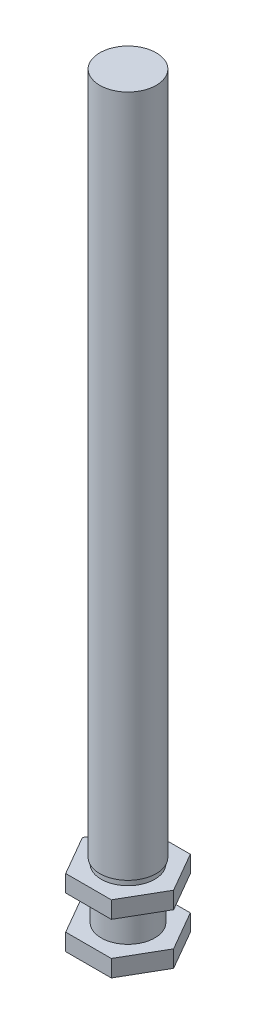
ISO-10303-21;
HEADER;
FILE_DESCRIPTION(('STEP AP214'),'2;1');
FILE_NAME('part.step','',(''),(''),'','','');
FILE_SCHEMA(('AUTOMOTIVE_DESIGN { 1 0 10303 214 1 1 1 1 }'));
ENDSEC;
DATA;
#1=APPLICATION_CONTEXT('core data for automotive mechanical design processes');
#2=APPLICATION_PROTOCOL_DEFINITION('international standard','automotive_design',2000,#1);
#3=PRODUCT_CONTEXT('',#1,'mechanical');
#4=PRODUCT('Part','Part','',(#3));
#5=PRODUCT_RELATED_PRODUCT_CATEGORY('part','',(#4));
#6=PRODUCT_DEFINITION_FORMATION('','',#4);
#7=PRODUCT_DEFINITION_CONTEXT('part definition',#1,'design');
#8=PRODUCT_DEFINITION('design','',#6,#7);
#9=PRODUCT_DEFINITION_SHAPE('','',#8);
#10=(LENGTH_UNIT() NAMED_UNIT(*) SI_UNIT(.MILLI.,.METRE.));
#11=(NAMED_UNIT(*) PLANE_ANGLE_UNIT() SI_UNIT($,.RADIAN.));
#12=(NAMED_UNIT(*) SI_UNIT($,.STERADIAN.) SOLID_ANGLE_UNIT());
#13=UNCERTAINTY_MEASURE_WITH_UNIT(LENGTH_MEASURE(1.E-05),#10,'distance_accuracy_value','');
#14=(GEOMETRIC_REPRESENTATION_CONTEXT(3) GLOBAL_UNCERTAINTY_ASSIGNED_CONTEXT((#13)) GLOBAL_UNIT_ASSIGNED_CONTEXT((#10,
#11,#12)) REPRESENTATION_CONTEXT('',''));
#15=CARTESIAN_POINT('',(0.,0.,0.));
#16=DIRECTION('',(0.,0.,1.));
#17=DIRECTION('',(1.,0.,0.));
#18=AXIS2_PLACEMENT_3D('',#15,#16,#17);
#19=CARTESIAN_POINT('',(0.,86.5,26.));
#20=DIRECTION('',(0.,-1.,0.));
#21=DIRECTION('',(0.,0.,-1.));
#22=AXIS2_PLACEMENT_3D('',#19,#20,#21);
#23=CYLINDRICAL_SURFACE('',#22,4.75);
#24=CARTESIAN_POINT('',(0.,76.5,26.));
#25=DIRECTION('',(0.,1.,0.));
#26=DIRECTION('',(0.,0.,1.));
#27=AXIS2_PLACEMENT_3D('',#24,#25,#26);
#28=CIRCLE('',#27,4.75);
#29=CARTESIAN_POINT('',(0.,76.5,30.75));
#30=VERTEX_POINT('',#29);
#31=EDGE_CURVE('E149',#30,#30,#28,.T.);
#32=ORIENTED_EDGE('',*,*,#31,.T.);
#33=EDGE_LOOP('',(#32));
#34=FACE_BOUND('',#33,.T.);
#35=CARTESIAN_POINT('',(0.,82.5,26.));
#36=DIRECTION('',(0.,1.,0.));
#37=DIRECTION('',(0.,0.,1.));
#38=AXIS2_PLACEMENT_3D('',#35,#36,#37);
#39=CIRCLE('',#38,4.75);
#40=CARTESIAN_POINT('',(0.,82.5,30.75));
#41=VERTEX_POINT('',#40);
#42=EDGE_CURVE('E11',#41,#41,#39,.T.);
#43=ORIENTED_EDGE('',*,*,#42,.F.);
#44=EDGE_LOOP('',(#43));
#45=FACE_BOUND('',#44,.T.);
#46=ADVANCED_FACE('F39',(#34,#45),#23,.T.);
#47=CARTESIAN_POINT('',(4.04145188432746,76.5,33.));
#48=DIRECTION('',(-0.866025403784441,0.,-0.499999999999995));
#49=DIRECTION('',(-0.499999999999995,0.,0.866025403784442));
#50=AXIS2_PLACEMENT_3D('',#47,#48,#49);
#51=PLANE('',#50);
#52=DIRECTION('',(0.499999999999995,0.,-0.866025403784441));
#53=VECTOR('',#52,1.);
#54=CARTESIAN_POINT('',(4.04145188432746,73.5,33.));
#55=LINE('',#54,#53);
#56=CARTESIAN_POINT('',(4.04145188432746,73.5,33.));
#57=VERTEX_POINT('',#56);
#58=CARTESIAN_POINT('',(8.08290376865476,73.5,26.));
#59=VERTEX_POINT('',#58);
#60=EDGE_CURVE('E130',#57,#59,#55,.T.);
#61=ORIENTED_EDGE('',*,*,#60,.T.);
#62=DIRECTION('',(0.,-1.,0.));
#63=VECTOR('',#62,1.);
#64=CARTESIAN_POINT('',(8.08290376865476,76.5,26.));
#65=LINE('',#64,#63);
#66=CARTESIAN_POINT('',(8.08290376865476,76.5,26.));
#67=VERTEX_POINT('',#66);
#68=EDGE_CURVE('E147',#67,#59,#65,.T.);
#69=ORIENTED_EDGE('',*,*,#68,.F.);
#70=DIRECTION('',(0.499999999999995,0.,-0.866025403784441));
#71=VECTOR('',#70,1.);
#72=CARTESIAN_POINT('',(4.04145188432746,76.5,33.));
#73=LINE('',#72,#71);
#74=CARTESIAN_POINT('',(4.04145188432746,76.5,33.));
#75=VERTEX_POINT('',#74);
#76=EDGE_CURVE('E140',#75,#67,#73,.T.);
#77=ORIENTED_EDGE('',*,*,#76,.F.);
#78=DIRECTION('',(0.,-1.,0.));
#79=VECTOR('',#78,1.);
#80=CARTESIAN_POINT('',(4.04145188432746,76.5,33.));
#81=LINE('',#80,#79);
#82=EDGE_CURVE('E126',#75,#57,#81,.T.);
#83=ORIENTED_EDGE('',*,*,#82,.T.);
#84=EDGE_LOOP('',(#61,#69,#77,#83));
#85=FACE_BOUND('',#84,.T.);
#86=ADVANCED_FACE('F177',(#85),#51,.F.);
#87=CARTESIAN_POINT('',(8.08290376865476,76.5,26.));
#88=DIRECTION('',(-0.866025403784438,0.,0.500000000000001));
#89=DIRECTION('',(0.500000000000001,0.,0.866025403784438));
#90=AXIS2_PLACEMENT_3D('',#87,#88,#89);
#91=PLANE('',#90);
#92=DIRECTION('',(-0.500000000000001,0.,-0.866025403784438));
#93=VECTOR('',#92,1.);
#94=CARTESIAN_POINT('',(8.08290376865476,73.5,26.));
#95=LINE('',#94,#93);
#96=CARTESIAN_POINT('',(4.04145188432736,73.5,19.));
#97=VERTEX_POINT('',#96);
#98=EDGE_CURVE('E133',#59,#97,#95,.T.);
#99=ORIENTED_EDGE('',*,*,#98,.T.);
#100=DIRECTION('',(0.,-1.,0.));
#101=VECTOR('',#100,1.);
#102=CARTESIAN_POINT('',(4.04145188432736,76.5,19.));
#103=LINE('',#102,#101);
#104=CARTESIAN_POINT('',(4.04145188432736,76.5,19.));
#105=VERTEX_POINT('',#104);
#106=EDGE_CURVE('E144',#105,#97,#103,.T.);
#107=ORIENTED_EDGE('',*,*,#106,.F.);
#108=DIRECTION('',(-0.500000000000001,0.,-0.866025403784438));
#109=VECTOR('',#108,1.);
#110=CARTESIAN_POINT('',(8.08290376865476,76.5,26.));
#111=LINE('',#110,#109);
#112=EDGE_CURVE('E96',#67,#105,#111,.T.);
#113=ORIENTED_EDGE('',*,*,#112,.F.);
#114=ORIENTED_EDGE('',*,*,#68,.T.);
#115=EDGE_LOOP('',(#99,#107,#113,#114));
#116=FACE_BOUND('',#115,.T.);
#117=ADVANCED_FACE('F182',(#116),#91,.F.);
#118=CARTESIAN_POINT('',(4.04145188432736,76.5,19.));
#119=DIRECTION('',(0.,0.,1.));
#120=DIRECTION('',(1.,0.,0.));
#121=AXIS2_PLACEMENT_3D('',#118,#119,#120);
#122=PLANE('',#121);
#123=DIRECTION('',(-1.,0.,0.));
#124=VECTOR('',#123,1.);
#125=CARTESIAN_POINT('',(4.04145188432736,73.5,19.));
#126=LINE('',#125,#124);
#127=CARTESIAN_POINT('',(-4.04145188432741,73.5,19.));
#128=VERTEX_POINT('',#127);
#129=EDGE_CURVE('E135',#97,#128,#126,.T.);
#130=ORIENTED_EDGE('',*,*,#129,.T.);
#131=DIRECTION('',(0.,-1.,0.));
#132=VECTOR('',#131,1.);
#133=CARTESIAN_POINT('',(-4.04145188432741,76.5,19.));
#134=LINE('',#133,#132);
#135=CARTESIAN_POINT('',(-4.04145188432741,76.5,19.));
#136=VERTEX_POINT('',#135);
#137=EDGE_CURVE('E121',#136,#128,#134,.T.);
#138=ORIENTED_EDGE('',*,*,#137,.F.);
#139=DIRECTION('',(-1.,0.,0.));
#140=VECTOR('',#139,1.);
#141=CARTESIAN_POINT('',(4.04145188432736,76.5,19.));
#142=LINE('',#141,#140);
#143=EDGE_CURVE('E112',#105,#136,#142,.T.);
#144=ORIENTED_EDGE('',*,*,#143,.F.);
#145=ORIENTED_EDGE('',*,*,#106,.T.);
#146=EDGE_LOOP('',(#130,#138,#144,#145));
#147=FACE_BOUND('',#146,.T.);
#148=ADVANCED_FACE('F278',(#147),#122,.F.);
#149=CARTESIAN_POINT('',(-4.04145188432741,76.5,19.));
#150=DIRECTION('',(0.866025403784441,0.,0.499999999999995));
#151=DIRECTION('',(0.499999999999995,0.,-0.866025403784442));
#152=AXIS2_PLACEMENT_3D('',#149,#150,#151);
#153=PLANE('',#152);
#154=DIRECTION('',(-0.499999999999995,0.,0.866025403784442));
#155=VECTOR('',#154,1.);
#156=CARTESIAN_POINT('',(-4.04145188432741,73.5,19.));
#157=LINE('',#156,#155);
#158=CARTESIAN_POINT('',(-8.08290376865476,73.5,26.0000000000001));
#159=VERTEX_POINT('',#158);
#160=EDGE_CURVE('E120',#128,#159,#157,.T.);
#161=ORIENTED_EDGE('',*,*,#160,.T.);
#162=DIRECTION('',(0.,-1.,0.));
#163=VECTOR('',#162,1.);
#164=CARTESIAN_POINT('',(-8.08290376865476,76.5,26.0000000000001));
#165=LINE('',#164,#163);
#166=CARTESIAN_POINT('',(-8.08290376865476,76.5,26.0000000000001));
#167=VERTEX_POINT('',#166);
#168=EDGE_CURVE('E117',#167,#159,#165,.T.);
#169=ORIENTED_EDGE('',*,*,#168,.F.);
#170=DIRECTION('',(-0.499999999999995,0.,0.866025403784442));
#171=VECTOR('',#170,1.);
#172=CARTESIAN_POINT('',(-4.04145188432741,76.5,19.));
#173=LINE('',#172,#171);
#174=EDGE_CURVE('E106',#136,#167,#173,.T.);
#175=ORIENTED_EDGE('',*,*,#174,.F.);
#176=ORIENTED_EDGE('',*,*,#137,.T.);
#177=EDGE_LOOP('',(#161,#169,#175,#176));
#178=FACE_BOUND('',#177,.T.);
#179=ADVANCED_FACE('F118',(#178),#153,.F.);
#180=CARTESIAN_POINT('',(-8.08290376865476,76.5,26.0000000000001));
#181=DIRECTION('',(0.866025403784434,0.,-0.500000000000007));
#182=DIRECTION('',(-0.500000000000007,0.,-0.866025403784435));
#183=AXIS2_PLACEMENT_3D('',#180,#181,#182);
#184=PLANE('',#183);
#185=DIRECTION('',(0.500000000000007,0.,0.866025403784435));
#186=VECTOR('',#185,1.);
#187=CARTESIAN_POINT('',(-8.08290376865476,73.5,26.0000000000001));
#188=LINE('',#187,#186);
#189=CARTESIAN_POINT('',(-4.04145188432731,73.5,33.));
#190=VERTEX_POINT('',#189);
#191=EDGE_CURVE('E81',#159,#190,#188,.T.);
#192=ORIENTED_EDGE('',*,*,#191,.T.);
#193=DIRECTION('',(0.,-1.,0.));
#194=VECTOR('',#193,1.);
#195=CARTESIAN_POINT('',(-4.04145188432731,76.5,33.));
#196=LINE('',#195,#194);
#197=CARTESIAN_POINT('',(-4.04145188432731,76.5,33.));
#198=VERTEX_POINT('',#197);
#199=EDGE_CURVE('E122',#198,#190,#196,.T.);
#200=ORIENTED_EDGE('',*,*,#199,.F.);
#201=DIRECTION('',(0.500000000000007,0.,0.866025403784435));
#202=VECTOR('',#201,1.);
#203=CARTESIAN_POINT('',(-8.08290376865476,76.5,26.0000000000001));
#204=LINE('',#203,#202);
#205=EDGE_CURVE('E110',#167,#198,#204,.T.);
#206=ORIENTED_EDGE('',*,*,#205,.F.);
#207=ORIENTED_EDGE('',*,*,#168,.T.);
#208=EDGE_LOOP('',(#192,#200,#206,#207));
#209=FACE_BOUND('',#208,.T.);
#210=ADVANCED_FACE('F124',(#209),#184,.F.);
#211=CARTESIAN_POINT('',(-4.04145188432731,76.5,33.));
#212=DIRECTION('',(0.,0.,-1.));
#213=DIRECTION('',(-1.,0.,0.));
#214=AXIS2_PLACEMENT_3D('',#211,#212,#213);
#215=PLANE('',#214);
#216=DIRECTION('',(1.,0.,0.));
#217=VECTOR('',#216,1.);
#218=CARTESIAN_POINT('',(-4.04145188432731,73.5,33.));
#219=LINE('',#218,#217);
#220=EDGE_CURVE('E87',#190,#57,#219,.T.);
#221=ORIENTED_EDGE('',*,*,#220,.T.);
#222=ORIENTED_EDGE('',*,*,#82,.F.);
#223=DIRECTION('',(1.,0.,0.));
#224=VECTOR('',#223,1.);
#225=CARTESIAN_POINT('',(-4.04145188432731,76.5,33.));
#226=LINE('',#225,#224);
#227=EDGE_CURVE('E57',#198,#75,#226,.T.);
#228=ORIENTED_EDGE('',*,*,#227,.F.);
#229=ORIENTED_EDGE('',*,*,#199,.T.);
#230=EDGE_LOOP('',(#221,#222,#228,#229));
#231=FACE_BOUND('',#230,.T.);
#232=ADVANCED_FACE('F165',(#231),#215,.F.);
#233=CARTESIAN_POINT('',(0.,76.5,0.));
#234=DIRECTION('',(0.,1.,0.));
#235=DIRECTION('',(0.,0.,1.));
#236=AXIS2_PLACEMENT_3D('',#233,#234,#235);
#237=PLANE('',#236);
#238=ORIENTED_EDGE('',*,*,#31,.F.);
#239=EDGE_LOOP('',(#238));
#240=FACE_BOUND('',#239,.T.);
#241=ORIENTED_EDGE('',*,*,#76,.T.);
#242=ORIENTED_EDGE('',*,*,#112,.T.);
#243=ORIENTED_EDGE('',*,*,#143,.T.);
#244=ORIENTED_EDGE('',*,*,#174,.T.);
#245=ORIENTED_EDGE('',*,*,#205,.T.);
#246=ORIENTED_EDGE('',*,*,#227,.T.);
#247=EDGE_LOOP('',(#241,#242,#243,#244,#245,#246));
#248=FACE_BOUND('',#247,.T.);
#249=ADVANCED_FACE('F108',(#240,#248),#237,.T.);
#250=CARTESIAN_POINT('',(0.,73.5,0.));
#251=DIRECTION('',(0.,1.,0.));
#252=DIRECTION('',(0.,0.,1.));
#253=AXIS2_PLACEMENT_3D('',#250,#251,#252);
#254=PLANE('',#253);
#255=CARTESIAN_POINT('',(0.,73.5,26.));
#256=DIRECTION('',(0.,1.,0.));
#257=DIRECTION('',(0.,0.,1.));
#258=AXIS2_PLACEMENT_3D('',#255,#256,#257);
#259=CIRCLE('',#258,4.75);
#260=CARTESIAN_POINT('',(0.,73.5,30.75));
#261=VERTEX_POINT('',#260);
#262=EDGE_CURVE('E49',#261,#261,#259,.T.);
#263=ORIENTED_EDGE('',*,*,#262,.T.);
#264=EDGE_LOOP('',(#263));
#265=FACE_BOUND('',#264,.T.);
#266=ORIENTED_EDGE('',*,*,#60,.F.);
#267=ORIENTED_EDGE('',*,*,#220,.F.);
#268=ORIENTED_EDGE('',*,*,#191,.F.);
#269=ORIENTED_EDGE('',*,*,#160,.F.);
#270=ORIENTED_EDGE('',*,*,#129,.F.);
#271=ORIENTED_EDGE('',*,*,#98,.F.);
#272=EDGE_LOOP('',(#266,#267,#268,#269,#270,#271));
#273=FACE_BOUND('',#272,.T.);
#274=ADVANCED_FACE('F164',(#265,#273),#254,.F.);
#275=CARTESIAN_POINT('',(0.,72.5,26.));
#276=DIRECTION('',(0.,1.,0.));
#277=DIRECTION('',(0.,0.,1.));
#278=AXIS2_PLACEMENT_3D('',#275,#276,#277);
#279=PLANE('',#278);
#280=CARTESIAN_POINT('',(0.,72.5,26.));
#281=DIRECTION('',(0.,1.,0.));
#282=DIRECTION('',(0.,0.,1.));
#283=AXIS2_PLACEMENT_3D('',#280,#281,#282);
#284=CIRCLE('',#283,4.75);
#285=CARTESIAN_POINT('',(0.,72.5,30.75));
#286=VERTEX_POINT('',#285);
#287=EDGE_CURVE('E153',#286,#286,#284,.T.);
#288=ORIENTED_EDGE('',*,*,#287,.F.);
#289=EDGE_LOOP('',(#288));
#290=FACE_BOUND('',#289,.T.);
#291=ADVANCED_FACE('F171',(#290),#279,.F.);
#292=ORIENTED_EDGE('',*,*,#287,.T.);
#293=EDGE_LOOP('',(#292));
#294=FACE_BOUND('',#293,.T.);
#295=ORIENTED_EDGE('',*,*,#262,.F.);
#296=EDGE_LOOP('',(#295));
#297=FACE_BOUND('',#296,.T.);
#298=ADVANCED_FACE('F178',(#294,#297),#23,.T.);
#299=CARTESIAN_POINT('',(4.04145188432746,85.5,33.));
#300=DIRECTION('',(-0.866025403784441,0.,-0.499999999999995));
#301=DIRECTION('',(-0.499999999999995,0.,0.866025403784442));
#302=AXIS2_PLACEMENT_3D('',#299,#300,#301);
#303=PLANE('',#302);
#304=DIRECTION('',(0.499999999999995,0.,-0.866025403784441));
#305=VECTOR('',#304,1.);
#306=CARTESIAN_POINT('',(4.04145188432746,82.5,33.));
#307=LINE('',#306,#305);
#308=CARTESIAN_POINT('',(4.04145188432746,82.5,33.));
#309=VERTEX_POINT('',#308);
#310=CARTESIAN_POINT('',(8.08290376865476,82.5,26.));
#311=VERTEX_POINT('',#310);
#312=EDGE_CURVE('E214',#309,#311,#307,.T.);
#313=ORIENTED_EDGE('',*,*,#312,.T.);
#314=DIRECTION('',(0.,-1.,0.));
#315=VECTOR('',#314,1.);
#316=CARTESIAN_POINT('',(8.08290376865476,85.5,26.));
#317=LINE('',#316,#315);
#318=CARTESIAN_POINT('',(8.08290376865476,85.5,26.));
#319=VERTEX_POINT('',#318);
#320=EDGE_CURVE('E270',#319,#311,#317,.T.);
#321=ORIENTED_EDGE('',*,*,#320,.F.);
#322=DIRECTION('',(0.499999999999995,0.,-0.866025403784441));
#323=VECTOR('',#322,1.);
#324=CARTESIAN_POINT('',(4.04145188432746,85.5,33.));
#325=LINE('',#324,#323);
#326=CARTESIAN_POINT('',(4.04145188432746,85.5,33.));
#327=VERTEX_POINT('',#326);
#328=EDGE_CURVE('E223',#327,#319,#325,.T.);
#329=ORIENTED_EDGE('',*,*,#328,.F.);
#330=DIRECTION('',(0.,-1.,0.));
#331=VECTOR('',#330,1.);
#332=CARTESIAN_POINT('',(4.04145188432746,85.5,33.));
#333=LINE('',#332,#331);
#334=EDGE_CURVE('E241',#327,#309,#333,.T.);
#335=ORIENTED_EDGE('',*,*,#334,.T.);
#336=EDGE_LOOP('',(#313,#321,#329,#335));
#337=FACE_BOUND('',#336,.T.);
#338=ADVANCED_FACE('F186',(#337),#303,.F.);
#339=CARTESIAN_POINT('',(8.08290376865476,85.5,26.));
#340=DIRECTION('',(-0.866025403784438,0.,0.500000000000001));
#341=DIRECTION('',(0.500000000000001,0.,0.866025403784438));
#342=AXIS2_PLACEMENT_3D('',#339,#340,#341);
#343=PLANE('',#342);
#344=DIRECTION('',(-0.500000000000001,0.,-0.866025403784438));
#345=VECTOR('',#344,1.);
#346=CARTESIAN_POINT('',(8.08290376865476,82.5,26.));
#347=LINE('',#346,#345);
#348=CARTESIAN_POINT('',(4.04145188432736,82.5,19.));
#349=VERTEX_POINT('',#348);
#350=EDGE_CURVE('E218',#311,#349,#347,.T.);
#351=ORIENTED_EDGE('',*,*,#350,.T.);
#352=DIRECTION('',(0.,-1.,0.));
#353=VECTOR('',#352,1.);
#354=CARTESIAN_POINT('',(4.04145188432736,85.5,19.));
#355=LINE('',#354,#353);
#356=CARTESIAN_POINT('',(4.04145188432736,85.5,19.));
#357=VERTEX_POINT('',#356);
#358=EDGE_CURVE('E267',#357,#349,#355,.T.);
#359=ORIENTED_EDGE('',*,*,#358,.F.);
#360=DIRECTION('',(-0.500000000000001,0.,-0.866025403784438));
#361=VECTOR('',#360,1.);
#362=CARTESIAN_POINT('',(8.08290376865476,85.5,26.));
#363=LINE('',#362,#361);
#364=EDGE_CURVE('E226',#319,#357,#363,.T.);
#365=ORIENTED_EDGE('',*,*,#364,.F.);
#366=ORIENTED_EDGE('',*,*,#320,.T.);
#367=EDGE_LOOP('',(#351,#359,#365,#366));
#368=FACE_BOUND('',#367,.T.);
#369=ADVANCED_FACE('F310',(#368),#343,.F.);
#370=CARTESIAN_POINT('',(4.04145188432736,85.5,19.));
#371=DIRECTION('',(0.,0.,1.));
#372=DIRECTION('',(1.,0.,0.));
#373=AXIS2_PLACEMENT_3D('',#370,#371,#372);
#374=PLANE('',#373);
#375=DIRECTION('',(-1.,0.,0.));
#376=VECTOR('',#375,1.);
#377=CARTESIAN_POINT('',(4.04145188432736,82.5,19.));
#378=LINE('',#377,#376);
#379=CARTESIAN_POINT('',(-4.04145188432741,82.5,19.));
#380=VERTEX_POINT('',#379);
#381=EDGE_CURVE('E245',#349,#380,#378,.T.);
#382=ORIENTED_EDGE('',*,*,#381,.T.);
#383=DIRECTION('',(0.,-1.,0.));
#384=VECTOR('',#383,1.);
#385=CARTESIAN_POINT('',(-4.04145188432741,85.5,19.));
#386=LINE('',#385,#384);
#387=CARTESIAN_POINT('',(-4.04145188432741,85.5,19.));
#388=VERTEX_POINT('',#387);
#389=EDGE_CURVE('E264',#388,#380,#386,.T.);
#390=ORIENTED_EDGE('',*,*,#389,.F.);
#391=DIRECTION('',(-1.,0.,0.));
#392=VECTOR('',#391,1.);
#393=CARTESIAN_POINT('',(4.04145188432736,85.5,19.));
#394=LINE('',#393,#392);
#395=EDGE_CURVE('E230',#357,#388,#394,.T.);
#396=ORIENTED_EDGE('',*,*,#395,.F.);
#397=ORIENTED_EDGE('',*,*,#358,.T.);
#398=EDGE_LOOP('',(#382,#390,#396,#397));
#399=FACE_BOUND('',#398,.T.);
#400=ADVANCED_FACE('F317',(#399),#374,.F.);
#401=CARTESIAN_POINT('',(-4.04145188432741,85.5,19.));
#402=DIRECTION('',(0.866025403784441,0.,0.499999999999995));
#403=DIRECTION('',(0.499999999999995,0.,-0.866025403784442));
#404=AXIS2_PLACEMENT_3D('',#401,#402,#403);
#405=PLANE('',#404);
#406=DIRECTION('',(-0.499999999999995,0.,0.866025403784442));
#407=VECTOR('',#406,1.);
#408=CARTESIAN_POINT('',(-4.04145188432741,82.5,19.));
#409=LINE('',#408,#407);
#410=CARTESIAN_POINT('',(-8.08290376865476,82.5,26.0000000000001));
#411=VERTEX_POINT('',#410);
#412=EDGE_CURVE('E248',#380,#411,#409,.T.);
#413=ORIENTED_EDGE('',*,*,#412,.T.);
#414=DIRECTION('',(0.,-1.,0.));
#415=VECTOR('',#414,1.);
#416=CARTESIAN_POINT('',(-8.08290376865476,85.5,26.0000000000001));
#417=LINE('',#416,#415);
#418=CARTESIAN_POINT('',(-8.08290376865476,85.5,26.0000000000001));
#419=VERTEX_POINT('',#418);
#420=EDGE_CURVE('E261',#419,#411,#417,.T.);
#421=ORIENTED_EDGE('',*,*,#420,.F.);
#422=DIRECTION('',(-0.499999999999995,0.,0.866025403784442));
#423=VECTOR('',#422,1.);
#424=CARTESIAN_POINT('',(-4.04145188432741,85.5,19.));
#425=LINE('',#424,#423);
#426=EDGE_CURVE('E233',#388,#419,#425,.T.);
#427=ORIENTED_EDGE('',*,*,#426,.F.);
#428=ORIENTED_EDGE('',*,*,#389,.T.);
#429=EDGE_LOOP('',(#413,#421,#427,#428));
#430=FACE_BOUND('',#429,.T.);
#431=ADVANCED_FACE('F325',(#430),#405,.F.);
#432=CARTESIAN_POINT('',(-8.08290376865476,85.5,26.0000000000001));
#433=DIRECTION('',(0.866025403784434,0.,-0.500000000000007));
#434=DIRECTION('',(-0.500000000000007,0.,-0.866025403784435));
#435=AXIS2_PLACEMENT_3D('',#432,#433,#434);
#436=PLANE('',#435);
#437=DIRECTION('',(0.500000000000007,0.,0.866025403784435));
#438=VECTOR('',#437,1.);
#439=CARTESIAN_POINT('',(-8.08290376865476,82.5,26.0000000000001));
#440=LINE('',#439,#438);
#441=CARTESIAN_POINT('',(-4.04145188432731,82.5,33.));
#442=VERTEX_POINT('',#441);
#443=EDGE_CURVE('E251',#411,#442,#440,.T.);
#444=ORIENTED_EDGE('',*,*,#443,.T.);
#445=DIRECTION('',(0.,-1.,0.));
#446=VECTOR('',#445,1.);
#447=CARTESIAN_POINT('',(-4.04145188432731,85.5,33.));
#448=LINE('',#447,#446);
#449=CARTESIAN_POINT('',(-4.04145188432731,85.5,33.));
#450=VERTEX_POINT('',#449);
#451=EDGE_CURVE('E258',#450,#442,#448,.T.);
#452=ORIENTED_EDGE('',*,*,#451,.F.);
#453=DIRECTION('',(0.500000000000007,0.,0.866025403784435));
#454=VECTOR('',#453,1.);
#455=CARTESIAN_POINT('',(-8.08290376865476,85.5,26.0000000000001));
#456=LINE('',#455,#454);
#457=EDGE_CURVE('E236',#419,#450,#456,.T.);
#458=ORIENTED_EDGE('',*,*,#457,.F.);
#459=ORIENTED_EDGE('',*,*,#420,.T.);
#460=EDGE_LOOP('',(#444,#452,#458,#459));
#461=FACE_BOUND('',#460,.T.);
#462=ADVANCED_FACE('F333',(#461),#436,.F.);
#463=CARTESIAN_POINT('',(-4.04145188432731,85.5,33.));
#464=DIRECTION('',(0.,0.,-1.));
#465=DIRECTION('',(-1.,0.,0.));
#466=AXIS2_PLACEMENT_3D('',#463,#464,#465);
#467=PLANE('',#466);
#468=DIRECTION('',(1.,0.,0.));
#469=VECTOR('',#468,1.);
#470=CARTESIAN_POINT('',(-4.04145188432731,82.5,33.));
#471=LINE('',#470,#469);
#472=EDGE_CURVE('E227',#442,#309,#471,.T.);
#473=ORIENTED_EDGE('',*,*,#472,.T.);
#474=ORIENTED_EDGE('',*,*,#334,.F.);
#475=DIRECTION('',(1.,0.,0.));
#476=VECTOR('',#475,1.);
#477=CARTESIAN_POINT('',(-4.04145188432731,85.5,33.));
#478=LINE('',#477,#476);
#479=EDGE_CURVE('E239',#450,#327,#478,.T.);
#480=ORIENTED_EDGE('',*,*,#479,.F.);
#481=ORIENTED_EDGE('',*,*,#451,.T.);
#482=EDGE_LOOP('',(#473,#474,#480,#481));
#483=FACE_BOUND('',#482,.T.);
#484=ADVANCED_FACE('F341',(#483),#467,.F.);
#485=CARTESIAN_POINT('',(0.,85.5,0.));
#486=DIRECTION('',(0.,1.,0.));
#487=DIRECTION('',(0.,0.,1.));
#488=AXIS2_PLACEMENT_3D('',#485,#486,#487);
#489=PLANE('',#488);
#490=CARTESIAN_POINT('',(0.,85.5,26.));
#491=DIRECTION('',(0.,1.,0.));
#492=DIRECTION('',(0.,0.,1.));
#493=AXIS2_PLACEMENT_3D('',#490,#491,#492);
#494=CIRCLE('',#493,4.75);
#495=CARTESIAN_POINT('',(0.,85.5,30.75));
#496=VERTEX_POINT('',#495);
#497=EDGE_CURVE('E43',#496,#496,#494,.T.);
#498=ORIENTED_EDGE('',*,*,#497,.F.);
#499=EDGE_LOOP('',(#498));
#500=FACE_BOUND('',#499,.T.);
#501=ORIENTED_EDGE('',*,*,#328,.T.);
#502=ORIENTED_EDGE('',*,*,#364,.T.);
#503=ORIENTED_EDGE('',*,*,#395,.T.);
#504=ORIENTED_EDGE('',*,*,#426,.T.);
#505=ORIENTED_EDGE('',*,*,#457,.T.);
#506=ORIENTED_EDGE('',*,*,#479,.T.);
#507=EDGE_LOOP('',(#501,#502,#503,#504,#505,#506));
#508=FACE_BOUND('',#507,.T.);
#509=ADVANCED_FACE('F199',(#500,#508),#489,.T.);
#510=CARTESIAN_POINT('',(0.,82.5,0.));
#511=DIRECTION('',(0.,1.,0.));
#512=DIRECTION('',(0.,0.,1.));
#513=AXIS2_PLACEMENT_3D('',#510,#511,#512);
#514=PLANE('',#513);
#515=ORIENTED_EDGE('',*,*,#42,.T.);
#516=EDGE_LOOP('',(#515));
#517=FACE_BOUND('',#516,.T.);
#518=ORIENTED_EDGE('',*,*,#312,.F.);
#519=ORIENTED_EDGE('',*,*,#472,.F.);
#520=ORIENTED_EDGE('',*,*,#443,.F.);
#521=ORIENTED_EDGE('',*,*,#412,.F.);
#522=ORIENTED_EDGE('',*,*,#381,.F.);
#523=ORIENTED_EDGE('',*,*,#350,.F.);
#524=EDGE_LOOP('',(#518,#519,#520,#521,#522,#523));
#525=FACE_BOUND('',#524,.T.);
#526=ADVANCED_FACE('F190',(#517,#525),#514,.F.);
#527=ORIENTED_EDGE('',*,*,#497,.T.);
#528=EDGE_LOOP('',(#527));
#529=FACE_BOUND('',#528,.T.);
#530=CARTESIAN_POINT('',(0.,86.5,26.));
#531=DIRECTION('',(0.,1.,0.));
#532=DIRECTION('',(0.,0.,1.));
#533=AXIS2_PLACEMENT_3D('',#530,#531,#532);
#534=CIRCLE('',#533,4.75);
#535=CARTESIAN_POINT('',(0.,86.5,30.75));
#536=VERTEX_POINT('',#535);
#537=EDGE_CURVE('E150',#536,#536,#534,.T.);
#538=ORIENTED_EDGE('',*,*,#537,.F.);
#539=EDGE_LOOP('',(#538));
#540=FACE_BOUND('',#539,.T.);
#541=ADVANCED_FACE('F41',(#529,#540),#23,.T.);
#542=CARTESIAN_POINT('',(0.,101.5,26.));
#543=DIRECTION('',(0.,-1.,0.));
#544=DIRECTION('',(0.,0.,-1.));
#545=AXIS2_PLACEMENT_3D('',#542,#543,#544);
#546=CYLINDRICAL_SURFACE('',#545,5.);
#547=CARTESIAN_POINT('',(0.,86.5,26.));
#548=DIRECTION('',(0.,1.,0.));
#549=DIRECTION('',(0.,0.,1.));
#550=AXIS2_PLACEMENT_3D('',#547,#548,#549);
#551=CIRCLE('',#550,5.);
#552=CARTESIAN_POINT('',(0.,86.5,31.));
#553=VERTEX_POINT('',#552);
#554=EDGE_CURVE('E213',#553,#553,#551,.T.);
#555=ORIENTED_EDGE('',*,*,#554,.T.);
#556=EDGE_LOOP('',(#555));
#557=FACE_BOUND('',#556,.T.);
#558=CARTESIAN_POINT('',(0.,207.5,26.));
#559=DIRECTION('',(0.,1.,0.));
#560=DIRECTION('',(0.,0.,1.));
#561=AXIS2_PLACEMENT_3D('',#558,#559,#560);
#562=CIRCLE('',#561,5.);
#563=CARTESIAN_POINT('',(0.,207.5,31.));
#564=VERTEX_POINT('',#563);
#565=EDGE_CURVE('E215',#564,#564,#562,.T.);
#566=ORIENTED_EDGE('',*,*,#565,.F.);
#567=EDGE_LOOP('',(#566));
#568=FACE_BOUND('',#567,.T.);
#569=ADVANCED_FACE('F189',(#557,#568),#546,.T.);
#570=CARTESIAN_POINT('',(0.,86.5,26.));
#571=DIRECTION('',(0.,1.,0.));
#572=DIRECTION('',(0.,0.,1.));
#573=AXIS2_PLACEMENT_3D('',#570,#571,#572);
#574=PLANE('',#573);
#575=ORIENTED_EDGE('',*,*,#537,.T.);
#576=EDGE_LOOP('',(#575));
#577=FACE_BOUND('',#576,.T.);
#578=ORIENTED_EDGE('',*,*,#554,.F.);
#579=EDGE_LOOP('',(#578));
#580=FACE_BOUND('',#579,.T.);
#581=ADVANCED_FACE('F196',(#577,#580),#574,.F.);
#582=CARTESIAN_POINT('',(0.,207.5,26.));
#583=DIRECTION('',(0.,1.,0.));
#584=DIRECTION('',(0.,0.,1.));
#585=AXIS2_PLACEMENT_3D('',#582,#583,#584);
#586=PLANE('',#585);
#587=ORIENTED_EDGE('',*,*,#565,.T.);
#588=EDGE_LOOP('',(#587));
#589=FACE_BOUND('',#588,.T.);
#590=ADVANCED_FACE('F209',(#589),#586,.T.);
#591=CLOSED_SHELL('',(#46,#86,#117,#148,#179,#210,#232,#249,#274,#291,#298,#338,#369,#400,#431,
#462,#484,#509,#526,#541,#569,#581,#590));
#592=MANIFOLD_SOLID_BREP('B2',#591);
#593=ADVANCED_BREP_SHAPE_REPRESENTATION('',(#18,#592),#14);
#594=SHAPE_DEFINITION_REPRESENTATION(#9,#593);
ENDSEC;
END-ISO-10303-21;
